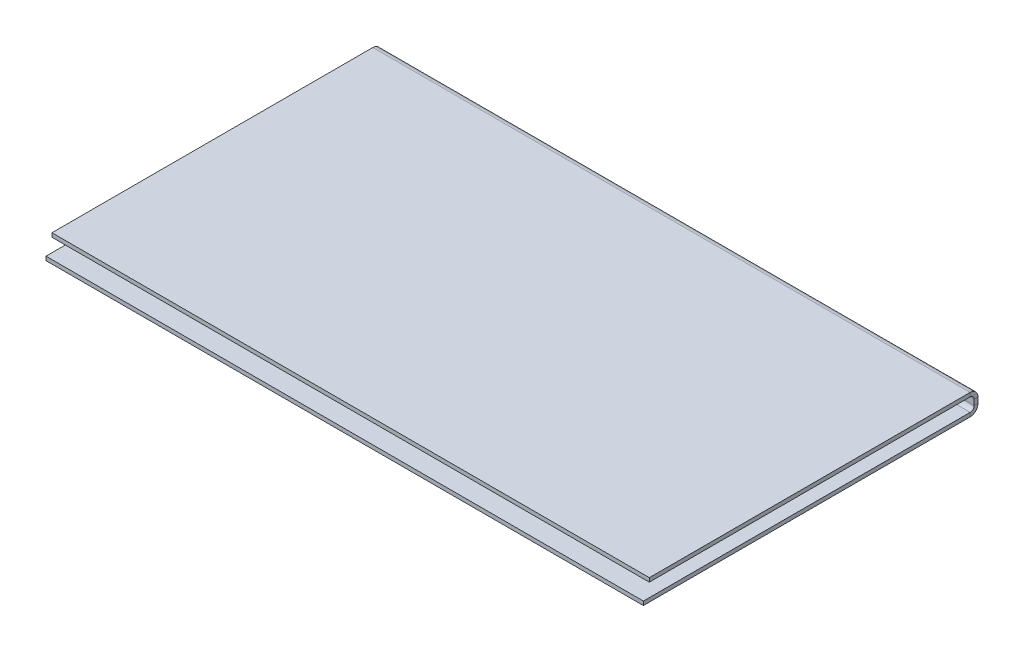
ISO-10303-21;
HEADER;
FILE_DESCRIPTION(('STEP AP214'),'2;1');
FILE_NAME('part.step','',(''),(''),'','','');
FILE_SCHEMA(('AUTOMOTIVE_DESIGN { 1 0 10303 214 1 1 1 1 }'));
ENDSEC;
DATA;
#1=APPLICATION_CONTEXT('core data for automotive mechanical design processes');
#2=APPLICATION_PROTOCOL_DEFINITION('international standard','automotive_design',2000,#1);
#3=PRODUCT_CONTEXT('',#1,'mechanical');
#4=PRODUCT('Part','Part','',(#3));
#5=PRODUCT_RELATED_PRODUCT_CATEGORY('part','',(#4));
#6=PRODUCT_DEFINITION_FORMATION('','',#4);
#7=PRODUCT_DEFINITION_CONTEXT('part definition',#1,'design');
#8=PRODUCT_DEFINITION('design','',#6,#7);
#9=PRODUCT_DEFINITION_SHAPE('','',#8);
#10=(LENGTH_UNIT() NAMED_UNIT(*) SI_UNIT(.MILLI.,.METRE.));
#11=(NAMED_UNIT(*) PLANE_ANGLE_UNIT() SI_UNIT($,.RADIAN.));
#12=(NAMED_UNIT(*) SI_UNIT($,.STERADIAN.) SOLID_ANGLE_UNIT());
#13=UNCERTAINTY_MEASURE_WITH_UNIT(LENGTH_MEASURE(1.E-05),#10,'distance_accuracy_value','');
#14=(GEOMETRIC_REPRESENTATION_CONTEXT(3) GLOBAL_UNCERTAINTY_ASSIGNED_CONTEXT((#13)) GLOBAL_UNIT_ASSIGNED_CONTEXT((#10,
#11,#12)) REPRESENTATION_CONTEXT('',''));
#15=CARTESIAN_POINT('',(0.,0.,0.));
#16=DIRECTION('',(0.,0.,1.));
#17=DIRECTION('',(1.,0.,0.));
#18=AXIS2_PLACEMENT_3D('',#15,#16,#17);
#19=CARTESIAN_POINT('',(0.,3.2634,-63.1208616509441));
#20=DIRECTION('',(-1.,0.,0.));
#21=DIRECTION('',(0.,0.,1.));
#22=AXIS2_PLACEMENT_3D('',#19,#20,#21);
#23=PLANE('',#22);
#24=DIRECTION('',(0.,-1.,0.));
#25=VECTOR('',#24,1.);
#26=CARTESIAN_POINT('',(0.,0.,-62.3842616509441));
#27=LINE('',#26,#25);
#28=CARTESIAN_POINT('',(0.,1.79020000000001,-62.3842616509441));
#29=VERTEX_POINT('',#28);
#30=CARTESIAN_POINT('',(0.,0.736599999999992,-62.3842616509441));
#31=VERTEX_POINT('',#30);
#32=EDGE_CURVE('E249',#29,#31,#27,.T.);
#33=ORIENTED_EDGE('',*,*,#32,.F.);
#34=DIRECTION('',(0.,0.,-1.));
#35=VECTOR('',#34,1.);
#36=CARTESIAN_POINT('',(0.,1.79020000000001,-62.3842616509441));
#37=LINE('',#36,#35);
#38=CARTESIAN_POINT('',(0.,1.79020000000001,-63.1208616509441));
#39=VERTEX_POINT('',#38);
#40=EDGE_CURVE('E231',#29,#39,#37,.T.);
#41=ORIENTED_EDGE('',*,*,#40,.T.);
#42=DIRECTION('',(0.,1.,0.));
#43=VECTOR('',#42,1.);
#44=CARTESIAN_POINT('',(0.,3.2634,-63.1208616509441));
#45=LINE('',#44,#43);
#46=CARTESIAN_POINT('',(0.,0.736600000000002,-63.1208616509441));
#47=VERTEX_POINT('',#46);
#48=EDGE_CURVE('E243',#39,#47,#45,.F.);
#49=ORIENTED_EDGE('',*,*,#48,.T.);
#50=DIRECTION('',(0.,0.,-1.));
#51=VECTOR('',#50,1.);
#52=CARTESIAN_POINT('',(0.,0.736599999999997,-62.3842616509441));
#53=LINE('',#52,#51);
#54=EDGE_CURVE('E255',#31,#47,#53,.T.);
#55=ORIENTED_EDGE('',*,*,#54,.F.);
#56=EDGE_LOOP('',(#33,#41,#49,#55));
#57=FACE_BOUND('',#56,.T.);
#58=ADVANCED_FACE('F85',(#57),#23,.T.);
#59=CARTESIAN_POINT('',(0.,0.,-63.1208616509441));
#60=DIRECTION('',(0.,0.,1.));
#61=DIRECTION('',(1.,0.,0.));
#62=AXIS2_PLACEMENT_3D('',#59,#60,#61);
#63=PLANE('',#62);
#64=DIRECTION('',(-1.,0.,0.));
#65=VECTOR('',#64,1.);
#66=CARTESIAN_POINT('',(0.,1.79020000000001,-63.1208616509441));
#67=LINE('',#66,#65);
#68=CARTESIAN_POINT('',(112.686822752281,1.79020000000001,-63.1208616509441));
#69=VERTEX_POINT('',#68);
#70=EDGE_CURVE('E181',#39,#69,#67,.F.);
#71=ORIENTED_EDGE('',*,*,#70,.T.);
#72=DIRECTION('',(0.,-1.,0.));
#73=VECTOR('',#72,1.);
#74=CARTESIAN_POINT('',(112.686822752281,0.,-63.1208616509441));
#75=LINE('',#74,#73);
#76=CARTESIAN_POINT('',(112.686822752281,0.736599999999992,-63.1208616509441));
#77=VERTEX_POINT('',#76);
#78=EDGE_CURVE('E246',#77,#69,#75,.F.);
#79=ORIENTED_EDGE('',*,*,#78,.F.);
#80=DIRECTION('',(-1.,0.,0.));
#81=VECTOR('',#80,1.);
#82=CARTESIAN_POINT('',(112.686822752281,0.736600000000002,-63.1208616509441));
#83=LINE('',#82,#81);
#84=EDGE_CURVE('E253',#47,#77,#83,.F.);
#85=ORIENTED_EDGE('',*,*,#84,.F.);
#86=ORIENTED_EDGE('',*,*,#48,.F.);
#87=EDGE_LOOP('',(#71,#79,#85,#86));
#88=FACE_BOUND('',#87,.T.);
#89=ADVANCED_FACE('F349',(#88),#63,.F.);
#90=CARTESIAN_POINT('',(0.,0.,-62.3842616509441));
#91=DIRECTION('',(0.,0.,1.));
#92=DIRECTION('',(1.,0.,0.));
#93=AXIS2_PLACEMENT_3D('',#90,#91,#92);
#94=PLANE('',#93);
#95=DIRECTION('',(0.,1.,0.));
#96=VECTOR('',#95,1.);
#97=CARTESIAN_POINT('',(112.686822752281,0.,-62.3842616509441));
#98=LINE('',#97,#96);
#99=CARTESIAN_POINT('',(112.686822752281,0.736599999999992,-62.3842616509441));
#100=VERTEX_POINT('',#99);
#101=CARTESIAN_POINT('',(112.686822752281,1.79020000000001,-62.3842616509441));
#102=VERTEX_POINT('',#101);
#103=EDGE_CURVE('E251',#100,#102,#98,.T.);
#104=ORIENTED_EDGE('',*,*,#103,.T.);
#105=DIRECTION('',(-1.,0.,0.));
#106=VECTOR('',#105,1.);
#107=CARTESIAN_POINT('',(0.,1.79020000000001,-62.3842616509441));
#108=LINE('',#107,#106);
#109=EDGE_CURVE('E100',#29,#102,#108,.F.);
#110=ORIENTED_EDGE('',*,*,#109,.F.);
#111=ORIENTED_EDGE('',*,*,#32,.T.);
#112=DIRECTION('',(-1.,0.,0.));
#113=VECTOR('',#112,1.);
#114=CARTESIAN_POINT('',(112.686822752281,0.736599999999997,-62.3842616509441));
#115=LINE('',#114,#113);
#116=EDGE_CURVE('E258',#100,#31,#115,.T.);
#117=ORIENTED_EDGE('',*,*,#116,.F.);
#118=EDGE_LOOP('',(#104,#110,#111,#117));
#119=FACE_BOUND('',#118,.T.);
#120=ADVANCED_FACE('F356',(#119),#94,.T.);
#121=CARTESIAN_POINT('',(0.,-0.7366,0.));
#122=DIRECTION('',(-1.,0.,0.));
#123=DIRECTION('',(0.,0.,1.));
#124=AXIS2_PLACEMENT_3D('',#121,#122,#123);
#125=PLANE('',#124);
#126=DIRECTION('',(0.,0.,1.));
#127=VECTOR('',#126,1.);
#128=CARTESIAN_POINT('',(0.,0.,0.));
#129=LINE('',#128,#127);
#130=CARTESIAN_POINT('',(0.,0.,-61.6476616509441));
#131=VERTEX_POINT('',#130);
#132=CARTESIAN_POINT('',(0.,0.,0.));
#133=VERTEX_POINT('',#132);
#134=EDGE_CURVE('E292',#131,#133,#129,.T.);
#135=ORIENTED_EDGE('',*,*,#134,.F.);
#136=DIRECTION('',(0.,-1.,0.));
#137=VECTOR('',#136,1.);
#138=CARTESIAN_POINT('',(0.,0.,-61.6476616509441));
#139=LINE('',#138,#137);
#140=CARTESIAN_POINT('',(0.,-0.736600000000005,-61.6476616509441));
#141=VERTEX_POINT('',#140);
#142=EDGE_CURVE('E268',#131,#141,#139,.T.);
#143=ORIENTED_EDGE('',*,*,#142,.T.);
#144=DIRECTION('',(0.,0.,1.));
#145=VECTOR('',#144,1.);
#146=CARTESIAN_POINT('',(0.,-0.7366,0.));
#147=LINE('',#146,#145);
#148=CARTESIAN_POINT('',(0.,-0.7366,0.));
#149=VERTEX_POINT('',#148);
#150=EDGE_CURVE('E295',#141,#149,#147,.T.);
#151=ORIENTED_EDGE('',*,*,#150,.T.);
#152=DIRECTION('',(0.,1.,0.));
#153=VECTOR('',#152,1.);
#154=CARTESIAN_POINT('',(0.,-0.7366,0.));
#155=LINE('',#154,#153);
#156=EDGE_CURVE('E89',#149,#133,#155,.T.);
#157=ORIENTED_EDGE('',*,*,#156,.T.);
#158=EDGE_LOOP('',(#135,#143,#151,#157));
#159=FACE_BOUND('',#158,.T.);
#160=ADVANCED_FACE('F87',(#159),#125,.T.);
#161=CARTESIAN_POINT('',(0.,-0.7366,0.));
#162=DIRECTION('',(0.,-1.,0.));
#163=DIRECTION('',(0.,0.,-1.));
#164=AXIS2_PLACEMENT_3D('',#161,#162,#163);
#165=PLANE('',#164);
#166=CARTESIAN_POINT('',(50.3806354978577,-0.7366,-13.1300326562346));
#167=DIRECTION('',(0.,1.,0.));
#168=DIRECTION('',(0.,0.,-1.));
#169=AXIS2_PLACEMENT_3D('',#166,#167,#168);
#170=CIRCLE('',#169,5.44342469547312);
#171=CARTESIAN_POINT('',(50.3806354978577,-0.7366,-18.5734573517077));
#172=VERTEX_POINT('',#171);
#173=EDGE_CURVE('E283',#172,#172,#170,.T.);
#174=ORIENTED_EDGE('',*,*,#173,.T.);
#175=EDGE_LOOP('',(#174));
#176=FACE_BOUND('',#175,.T.);
#177=CARTESIAN_POINT('',(50.3806354978577,-0.7366,-49.9908289947094));
#178=DIRECTION('',(0.,1.,0.));
#179=DIRECTION('',(0.,0.,1.));
#180=AXIS2_PLACEMENT_3D('',#177,#178,#179);
#181=CIRCLE('',#180,5.44342469547312);
#182=CARTESIAN_POINT('',(50.3806354978577,-0.7366,-44.5474042992363));
#183=VERTEX_POINT('',#182);
#184=EDGE_CURVE('E289',#183,#183,#181,.T.);
#185=ORIENTED_EDGE('',*,*,#184,.T.);
#186=EDGE_LOOP('',(#185));
#187=FACE_BOUND('',#186,.T.);
#188=ORIENTED_EDGE('',*,*,#150,.F.);
#189=DIRECTION('',(-1.,0.,0.));
#190=VECTOR('',#189,1.);
#191=CARTESIAN_POINT('',(0.,-0.736600000000005,-61.6476616509441));
#192=LINE('',#191,#190);
#193=CARTESIAN_POINT('',(112.686822752281,-0.7366,-61.6476616509441));
#194=VERTEX_POINT('',#193);
#195=EDGE_CURVE('E263',#141,#194,#192,.F.);
#196=ORIENTED_EDGE('',*,*,#195,.T.);
#197=DIRECTION('',(0.,0.,-1.));
#198=VECTOR('',#197,1.);
#199=CARTESIAN_POINT('',(112.686822752281,-0.7366,0.));
#200=LINE('',#199,#198);
#201=CARTESIAN_POINT('',(112.686822752281,-0.7366,0.));
#202=VERTEX_POINT('',#201);
#203=EDGE_CURVE('E301',#202,#194,#200,.T.);
#204=ORIENTED_EDGE('',*,*,#203,.F.);
#205=DIRECTION('',(1.,0.,0.));
#206=VECTOR('',#205,1.);
#207=CARTESIAN_POINT('',(0.,-0.7366,0.));
#208=LINE('',#207,#206);
#209=EDGE_CURVE('E297',#149,#202,#208,.T.);
#210=ORIENTED_EDGE('',*,*,#209,.F.);
#211=EDGE_LOOP('',(#188,#196,#204,#210));
#212=FACE_BOUND('',#211,.T.);
#213=ADVANCED_FACE('F324',(#176,#187,#212),#165,.T.);
#214=CARTESIAN_POINT('',(0.,0.,0.));
#215=DIRECTION('',(0.,-1.,0.));
#216=DIRECTION('',(0.,0.,-1.));
#217=AXIS2_PLACEMENT_3D('',#214,#215,#216);
#218=PLANE('',#217);
#219=CARTESIAN_POINT('',(50.3806354978577,0.,-49.9908289947094));
#220=DIRECTION('',(0.,1.,0.));
#221=DIRECTION('',(0.,0.,1.));
#222=AXIS2_PLACEMENT_3D('',#219,#220,#221);
#223=CIRCLE('',#222,5.44342469547312);
#224=CARTESIAN_POINT('',(50.3806354978577,0.,-44.5474042992363));
#225=VERTEX_POINT('',#224);
#226=EDGE_CURVE('E286',#225,#225,#223,.T.);
#227=ORIENTED_EDGE('',*,*,#226,.F.);
#228=EDGE_LOOP('',(#227));
#229=FACE_BOUND('',#228,.T.);
#230=CARTESIAN_POINT('',(50.3806354978577,0.,-13.1300326562346));
#231=DIRECTION('',(0.,1.,0.));
#232=DIRECTION('',(0.,0.,-1.));
#233=AXIS2_PLACEMENT_3D('',#230,#231,#232);
#234=CIRCLE('',#233,5.44342469547312);
#235=CARTESIAN_POINT('',(50.3806354978577,0.,-18.5734573517077));
#236=VERTEX_POINT('',#235);
#237=EDGE_CURVE('E280',#236,#236,#234,.T.);
#238=ORIENTED_EDGE('',*,*,#237,.F.);
#239=EDGE_LOOP('',(#238));
#240=FACE_BOUND('',#239,.T.);
#241=DIRECTION('',(-1.,0.,0.));
#242=VECTOR('',#241,1.);
#243=CARTESIAN_POINT('',(0.,0.,-61.6476616509441));
#244=LINE('',#243,#242);
#245=CARTESIAN_POINT('',(112.686822752281,0.,-61.6476616509441));
#246=VERTEX_POINT('',#245);
#247=EDGE_CURVE('E274',#131,#246,#244,.F.);
#248=ORIENTED_EDGE('',*,*,#247,.F.);
#249=ORIENTED_EDGE('',*,*,#134,.T.);
#250=DIRECTION('',(1.,0.,0.));
#251=VECTOR('',#250,1.);
#252=CARTESIAN_POINT('',(0.,0.,0.));
#253=LINE('',#252,#251);
#254=CARTESIAN_POINT('',(112.686822752281,0.,0.));
#255=VERTEX_POINT('',#254);
#256=EDGE_CURVE('E305',#133,#255,#253,.T.);
#257=ORIENTED_EDGE('',*,*,#256,.T.);
#258=DIRECTION('',(0.,0.,-1.));
#259=VECTOR('',#258,1.);
#260=CARTESIAN_POINT('',(112.686822752281,0.,0.));
#261=LINE('',#260,#259);
#262=EDGE_CURVE('E298',#255,#246,#261,.T.);
#263=ORIENTED_EDGE('',*,*,#262,.T.);
#264=EDGE_LOOP('',(#248,#249,#257,#263));
#265=FACE_BOUND('',#264,.T.);
#266=ADVANCED_FACE('F313',(#229,#240,#265),#218,.F.);
#267=CARTESIAN_POINT('',(112.686822752281,-0.7366,0.));
#268=DIRECTION('',(1.,0.,0.));
#269=DIRECTION('',(0.,0.,-1.));
#270=AXIS2_PLACEMENT_3D('',#267,#268,#269);
#271=PLANE('',#270);
#272=DIRECTION('',(0.,-1.,0.));
#273=VECTOR('',#272,1.);
#274=CARTESIAN_POINT('',(112.686822752281,0.,-61.6476616509441));
#275=LINE('',#274,#273);
#276=EDGE_CURVE('E278',#246,#194,#275,.T.);
#277=ORIENTED_EDGE('',*,*,#276,.F.);
#278=ORIENTED_EDGE('',*,*,#262,.F.);
#279=DIRECTION('',(0.,1.,0.));
#280=VECTOR('',#279,1.);
#281=CARTESIAN_POINT('',(112.686822752281,-0.7366,0.));
#282=LINE('',#281,#280);
#283=EDGE_CURVE('E13',#202,#255,#282,.T.);
#284=ORIENTED_EDGE('',*,*,#283,.F.);
#285=ORIENTED_EDGE('',*,*,#203,.T.);
#286=EDGE_LOOP('',(#277,#278,#284,#285));
#287=FACE_BOUND('',#286,.T.);
#288=ADVANCED_FACE('F317',(#287),#271,.T.);
#289=CARTESIAN_POINT('',(0.,-0.7366,0.));
#290=DIRECTION('',(0.,0.,1.));
#291=DIRECTION('',(1.,0.,0.));
#292=AXIS2_PLACEMENT_3D('',#289,#290,#291);
#293=PLANE('',#292);
#294=ORIENTED_EDGE('',*,*,#256,.F.);
#295=ORIENTED_EDGE('',*,*,#156,.F.);
#296=ORIENTED_EDGE('',*,*,#209,.T.);
#297=ORIENTED_EDGE('',*,*,#283,.T.);
#298=EDGE_LOOP('',(#294,#295,#296,#297));
#299=FACE_BOUND('',#298,.T.);
#300=ADVANCED_FACE('F337',(#299),#293,.T.);
#301=CARTESIAN_POINT('',(50.3806354978577,-0.7366,-49.9908289947094));
#302=DIRECTION('',(0.,1.,0.));
#303=DIRECTION('',(0.,0.,1.));
#304=AXIS2_PLACEMENT_3D('',#301,#302,#303);
#305=CYLINDRICAL_SURFACE('',#304,5.44342469547312);
#306=ORIENTED_EDGE('',*,*,#184,.F.);
#307=EDGE_LOOP('',(#306));
#308=FACE_BOUND('',#307,.T.);
#309=ORIENTED_EDGE('',*,*,#226,.T.);
#310=EDGE_LOOP('',(#309));
#311=FACE_BOUND('',#310,.T.);
#312=ADVANCED_FACE('F339',(#308,#311),#305,.F.);
#313=CARTESIAN_POINT('',(50.3806354978577,-0.7366,-13.1300326562346));
#314=DIRECTION('',(0.,1.,0.));
#315=DIRECTION('',(0.,0.,1.));
#316=AXIS2_PLACEMENT_3D('',#313,#314,#315);
#317=CYLINDRICAL_SURFACE('',#316,5.44342469547312);
#318=ORIENTED_EDGE('',*,*,#173,.F.);
#319=EDGE_LOOP('',(#318));
#320=FACE_BOUND('',#319,.T.);
#321=ORIENTED_EDGE('',*,*,#237,.T.);
#322=EDGE_LOOP('',(#321));
#323=FACE_BOUND('',#322,.T.);
#324=ADVANCED_FACE('F343',(#320,#323),#317,.F.);
#325=CARTESIAN_POINT('',(112.686822752281,0.736599999999992,-61.6476616509441));
#326=DIRECTION('',(1.,0.,0.));
#327=DIRECTION('',(0.,0.,-1.));
#328=AXIS2_PLACEMENT_3D('',#325,#326,#327);
#329=PLANE('',#328);
#330=DIRECTION('',(0.,0.,-1.));
#331=VECTOR('',#330,1.);
#332=CARTESIAN_POINT('',(112.686822752281,0.736600000000002,-63.1208616509441));
#333=LINE('',#332,#331);
#334=EDGE_CURVE('E240',#100,#77,#333,.T.);
#335=ORIENTED_EDGE('',*,*,#334,.F.);
#336=CARTESIAN_POINT('',(112.686822752281,0.736599999999992,-61.6476616509441));
#337=DIRECTION('',(-1.,0.,0.));
#338=DIRECTION('',(0.,0.,1.));
#339=AXIS2_PLACEMENT_3D('',#336,#337,#338);
#340=CIRCLE('',#339,0.736599999999997);
#341=EDGE_CURVE('E271',#246,#100,#340,.F.);
#342=ORIENTED_EDGE('',*,*,#341,.F.);
#343=ORIENTED_EDGE('',*,*,#276,.T.);
#344=CARTESIAN_POINT('',(112.686822752281,0.736599999999992,-61.6476616509441));
#345=DIRECTION('',(-1.,0.,0.));
#346=DIRECTION('',(0.,0.,1.));
#347=AXIS2_PLACEMENT_3D('',#344,#345,#346);
#348=CIRCLE('',#347,1.4732);
#349=EDGE_CURVE('E108',#194,#77,#348,.F.);
#350=ORIENTED_EDGE('',*,*,#349,.T.);
#351=EDGE_LOOP('',(#335,#342,#343,#350));
#352=FACE_BOUND('',#351,.T.);
#353=ADVANCED_FACE('F321',(#352),#329,.T.);
#354=CARTESIAN_POINT('',(0.,0.736599999999992,-61.6476616509441));
#355=DIRECTION('',(1.,0.,0.));
#356=DIRECTION('',(0.,0.,-1.));
#357=AXIS2_PLACEMENT_3D('',#354,#355,#356);
#358=PLANE('',#357);
#359=CARTESIAN_POINT('',(0.,0.736599999999992,-61.6476616509441));
#360=DIRECTION('',(-1.,0.,0.));
#361=DIRECTION('',(0.,0.,1.));
#362=AXIS2_PLACEMENT_3D('',#359,#360,#361);
#363=CIRCLE('',#362,0.736599999999997);
#364=EDGE_CURVE('E245',#31,#131,#363,.T.);
#365=ORIENTED_EDGE('',*,*,#364,.F.);
#366=ORIENTED_EDGE('',*,*,#54,.T.);
#367=CARTESIAN_POINT('',(0.,0.736599999999992,-61.6476616509441));
#368=DIRECTION('',(-1.,0.,0.));
#369=DIRECTION('',(0.,0.,1.));
#370=AXIS2_PLACEMENT_3D('',#367,#368,#369);
#371=CIRCLE('',#370,1.4732);
#372=EDGE_CURVE('E266',#47,#141,#371,.T.);
#373=ORIENTED_EDGE('',*,*,#372,.T.);
#374=ORIENTED_EDGE('',*,*,#142,.F.);
#375=EDGE_LOOP('',(#365,#366,#373,#374));
#376=FACE_BOUND('',#375,.T.);
#377=ADVANCED_FACE('F330',(#376),#358,.F.);
#378=CARTESIAN_POINT('',(0.,0.736599999999992,-61.6476616509441));
#379=DIRECTION('',(-1.,0.,0.));
#380=DIRECTION('',(0.,0.,-1.));
#381=AXIS2_PLACEMENT_3D('',#378,#379,#380);
#382=CYLINDRICAL_SURFACE('',#381,1.4732);
#383=ORIENTED_EDGE('',*,*,#195,.F.);
#384=ORIENTED_EDGE('',*,*,#372,.F.);
#385=ORIENTED_EDGE('',*,*,#84,.T.);
#386=ORIENTED_EDGE('',*,*,#349,.F.);
#387=EDGE_LOOP('',(#383,#384,#385,#386));
#388=FACE_BOUND('',#387,.T.);
#389=ADVANCED_FACE('F327',(#388),#382,.T.);
#390=CARTESIAN_POINT('',(0.,0.736599999999992,-61.6476616509441));
#391=DIRECTION('',(-1.,0.,0.));
#392=DIRECTION('',(0.,0.,-1.));
#393=AXIS2_PLACEMENT_3D('',#390,#391,#392);
#394=CYLINDRICAL_SURFACE('',#393,0.736599999999997);
#395=ORIENTED_EDGE('',*,*,#247,.T.);
#396=ORIENTED_EDGE('',*,*,#341,.T.);
#397=ORIENTED_EDGE('',*,*,#116,.T.);
#398=ORIENTED_EDGE('',*,*,#364,.T.);
#399=EDGE_LOOP('',(#395,#396,#397,#398));
#400=FACE_BOUND('',#399,.T.);
#401=ADVANCED_FACE('F365',(#400),#394,.F.);
#402=CARTESIAN_POINT('',(112.686822752281,0.,-63.1208616509441));
#403=DIRECTION('',(1.,0.,0.));
#404=DIRECTION('',(0.,0.,-1.));
#405=AXIS2_PLACEMENT_3D('',#402,#403,#404);
#406=PLANE('',#405);
#407=DIRECTION('',(0.,0.,-1.));
#408=VECTOR('',#407,1.);
#409=CARTESIAN_POINT('',(112.686822752281,1.79020000000001,-62.3842616509441));
#410=LINE('',#409,#408);
#411=EDGE_CURVE('E237',#102,#69,#410,.T.);
#412=ORIENTED_EDGE('',*,*,#411,.F.);
#413=ORIENTED_EDGE('',*,*,#103,.F.);
#414=ORIENTED_EDGE('',*,*,#334,.T.);
#415=ORIENTED_EDGE('',*,*,#78,.T.);
#416=EDGE_LOOP('',(#412,#413,#414,#415));
#417=FACE_BOUND('',#416,.T.);
#418=ADVANCED_FACE('F361',(#417),#406,.T.);
#419=CARTESIAN_POINT('',(112.686822752281,1.79020000000001,-61.6476616509441));
#420=DIRECTION('',(1.,0.,0.));
#421=DIRECTION('',(0.,0.,-1.));
#422=AXIS2_PLACEMENT_3D('',#419,#420,#421);
#423=PLANE('',#422);
#424=DIRECTION('',(0.,1.,0.));
#425=VECTOR('',#424,1.);
#426=CARTESIAN_POINT('',(112.686822752281,3.26340000000001,-61.6476616509441));
#427=LINE('',#426,#425);
#428=CARTESIAN_POINT('',(112.686822752281,2.52680000000001,-61.6476616509441));
#429=VERTEX_POINT('',#428);
#430=CARTESIAN_POINT('',(112.686822752281,3.26340000000001,-61.6476616509441));
#431=VERTEX_POINT('',#430);
#432=EDGE_CURVE('E226',#429,#431,#427,.T.);
#433=ORIENTED_EDGE('',*,*,#432,.F.);
#434=CARTESIAN_POINT('',(112.686822752281,1.79020000000001,-61.6476616509441));
#435=DIRECTION('',(-1.,0.,0.));
#436=DIRECTION('',(0.,0.,1.));
#437=AXIS2_PLACEMENT_3D('',#434,#435,#436);
#438=CIRCLE('',#437,0.7366);
#439=EDGE_CURVE('E184',#102,#429,#438,.F.);
#440=ORIENTED_EDGE('',*,*,#439,.F.);
#441=ORIENTED_EDGE('',*,*,#411,.T.);
#442=CARTESIAN_POINT('',(112.686822752281,1.79020000000001,-61.6476616509441));
#443=DIRECTION('',(-1.,0.,0.));
#444=DIRECTION('',(0.,0.,1.));
#445=AXIS2_PLACEMENT_3D('',#442,#443,#444);
#446=CIRCLE('',#445,1.4732);
#447=EDGE_CURVE('E230',#69,#431,#446,.F.);
#448=ORIENTED_EDGE('',*,*,#447,.T.);
#449=EDGE_LOOP('',(#433,#440,#441,#448));
#450=FACE_BOUND('',#449,.T.);
#451=ADVANCED_FACE('F364',(#450),#423,.T.);
#452=CARTESIAN_POINT('',(0.,1.79020000000001,-61.6476616509441));
#453=DIRECTION('',(1.,0.,0.));
#454=DIRECTION('',(0.,0.,-1.));
#455=AXIS2_PLACEMENT_3D('',#452,#453,#454);
#456=PLANE('',#455);
#457=CARTESIAN_POINT('',(0.,1.79020000000001,-61.6476616509441));
#458=DIRECTION('',(-1.,0.,0.));
#459=DIRECTION('',(0.,0.,1.));
#460=AXIS2_PLACEMENT_3D('',#457,#458,#459);
#461=CIRCLE('',#460,0.7366);
#462=CARTESIAN_POINT('',(0.,2.52680000000001,-61.6476616509441));
#463=VERTEX_POINT('',#462);
#464=EDGE_CURVE('E191',#463,#29,#461,.T.);
#465=ORIENTED_EDGE('',*,*,#464,.F.);
#466=DIRECTION('',(0.,1.,0.));
#467=VECTOR('',#466,1.);
#468=CARTESIAN_POINT('',(0.,2.52680000000001,-61.6476616509441));
#469=LINE('',#468,#467);
#470=CARTESIAN_POINT('',(0.,3.26340000000001,-61.6476616509441));
#471=VERTEX_POINT('',#470);
#472=EDGE_CURVE('E188',#463,#471,#469,.T.);
#473=ORIENTED_EDGE('',*,*,#472,.T.);
#474=CARTESIAN_POINT('',(0.,1.79020000000001,-61.6476616509441));
#475=DIRECTION('',(-1.,0.,0.));
#476=DIRECTION('',(0.,0.,1.));
#477=AXIS2_PLACEMENT_3D('',#474,#475,#476);
#478=CIRCLE('',#477,1.4732);
#479=EDGE_CURVE('E174',#471,#39,#478,.T.);
#480=ORIENTED_EDGE('',*,*,#479,.T.);
#481=ORIENTED_EDGE('',*,*,#40,.F.);
#482=EDGE_LOOP('',(#465,#473,#480,#481));
#483=FACE_BOUND('',#482,.T.);
#484=ADVANCED_FACE('F189',(#483),#456,.F.);
#485=CARTESIAN_POINT('',(0.,1.79020000000001,-61.6476616509441));
#486=DIRECTION('',(-1.,0.,0.));
#487=DIRECTION('',(0.,1.,0.));
#488=AXIS2_PLACEMENT_3D('',#485,#486,#487);
#489=CYLINDRICAL_SURFACE('',#488,1.4732);
#490=ORIENTED_EDGE('',*,*,#70,.F.);
#491=ORIENTED_EDGE('',*,*,#479,.F.);
#492=DIRECTION('',(-1.,0.,0.));
#493=VECTOR('',#492,1.);
#494=CARTESIAN_POINT('',(0.,3.26340000000001,-61.6476616509441));
#495=LINE('',#494,#493);
#496=EDGE_CURVE('E179',#431,#471,#495,.T.);
#497=ORIENTED_EDGE('',*,*,#496,.F.);
#498=ORIENTED_EDGE('',*,*,#447,.F.);
#499=EDGE_LOOP('',(#490,#491,#497,#498));
#500=FACE_BOUND('',#499,.T.);
#501=ADVANCED_FACE('F176',(#500),#489,.T.);
#502=CARTESIAN_POINT('',(0.,1.79020000000001,-61.6476616509441));
#503=DIRECTION('',(-1.,0.,0.));
#504=DIRECTION('',(0.,1.,0.));
#505=AXIS2_PLACEMENT_3D('',#502,#503,#504);
#506=CYLINDRICAL_SURFACE('',#505,0.7366);
#507=ORIENTED_EDGE('',*,*,#109,.T.);
#508=ORIENTED_EDGE('',*,*,#439,.T.);
#509=DIRECTION('',(1.,0.,0.));
#510=VECTOR('',#509,1.);
#511=CARTESIAN_POINT('',(112.686822752281,2.52680000000001,-61.6476616509441));
#512=LINE('',#511,#510);
#513=EDGE_CURVE('E196',#429,#463,#512,.F.);
#514=ORIENTED_EDGE('',*,*,#513,.T.);
#515=ORIENTED_EDGE('',*,*,#464,.T.);
#516=EDGE_LOOP('',(#507,#508,#514,#515));
#517=FACE_BOUND('',#516,.T.);
#518=ADVANCED_FACE('F474',(#517),#506,.F.);
#519=CARTESIAN_POINT('',(0.,3.2634,-62.3842616509441));
#520=DIRECTION('',(-1.,0.,0.));
#521=DIRECTION('',(0.,0.,1.));
#522=AXIS2_PLACEMENT_3D('',#519,#520,#521);
#523=PLANE('',#522);
#524=DIRECTION('',(0.,0.,-1.));
#525=VECTOR('',#524,1.);
#526=CARTESIAN_POINT('',(0.,3.2634,-62.3842616509441));
#527=LINE('',#526,#525);
#528=CARTESIAN_POINT('',(0.,3.26340000000022,-1.12086165094402));
#529=VERTEX_POINT('',#528);
#530=EDGE_CURVE('E203',#529,#471,#527,.T.);
#531=ORIENTED_EDGE('',*,*,#530,.T.);
#532=ORIENTED_EDGE('',*,*,#472,.F.);
#533=DIRECTION('',(0.,0.,1.));
#534=VECTOR('',#533,1.);
#535=CARTESIAN_POINT('',(0.,2.52680000000022,0.));
#536=LINE('',#535,#534);
#537=CARTESIAN_POINT('',(0.,2.52680000000022,-1.12086165094402));
#538=VERTEX_POINT('',#537);
#539=EDGE_CURVE('E219',#538,#463,#536,.F.);
#540=ORIENTED_EDGE('',*,*,#539,.F.);
#541=DIRECTION('',(0.,-1.,0.));
#542=VECTOR('',#541,1.);
#543=CARTESIAN_POINT('',(0.,3.26340000000022,-1.12086165094402));
#544=LINE('',#543,#542);
#545=EDGE_CURVE('E208',#529,#538,#544,.T.);
#546=ORIENTED_EDGE('',*,*,#545,.F.);
#547=EDGE_LOOP('',(#531,#532,#540,#546));
#548=FACE_BOUND('',#547,.T.);
#549=ADVANCED_FACE('F207',(#548),#523,.T.);
#550=CARTESIAN_POINT('',(112.686822752281,3.26340000000022,-1.12086165094402));
#551=DIRECTION('',(1.,0.,0.));
#552=DIRECTION('',(0.,0.,-1.));
#553=AXIS2_PLACEMENT_3D('',#550,#551,#552);
#554=PLANE('',#553);
#555=DIRECTION('',(0.,0.,-1.));
#556=VECTOR('',#555,1.);
#557=CARTESIAN_POINT('',(112.686822752281,2.52680000000022,0.));
#558=LINE('',#557,#556);
#559=CARTESIAN_POINT('',(112.686822752281,2.52680000000022,-1.12086165094402));
#560=VERTEX_POINT('',#559);
#561=EDGE_CURVE('E205',#429,#560,#558,.F.);
#562=ORIENTED_EDGE('',*,*,#561,.F.);
#563=ORIENTED_EDGE('',*,*,#432,.T.);
#564=DIRECTION('',(0.,0.,1.));
#565=VECTOR('',#564,1.);
#566=CARTESIAN_POINT('',(112.686822752281,3.26340000000022,-1.12086165094402));
#567=LINE('',#566,#565);
#568=CARTESIAN_POINT('',(112.686822752281,3.26340000000022,-1.12086165094402));
#569=VERTEX_POINT('',#568);
#570=EDGE_CURVE('E204',#431,#569,#567,.T.);
#571=ORIENTED_EDGE('',*,*,#570,.T.);
#572=DIRECTION('',(0.,-1.,0.));
#573=VECTOR('',#572,1.);
#574=CARTESIAN_POINT('',(112.686822752281,3.26340000000022,-1.12086165094402));
#575=LINE('',#574,#573);
#576=EDGE_CURVE('E210',#569,#560,#575,.T.);
#577=ORIENTED_EDGE('',*,*,#576,.T.);
#578=EDGE_LOOP('',(#562,#563,#571,#577));
#579=FACE_BOUND('',#578,.T.);
#580=ADVANCED_FACE('F494',(#579),#554,.T.);
#581=CARTESIAN_POINT('',(0.,3.26340000000022,0.));
#582=DIRECTION('',(0.,1.,0.));
#583=DIRECTION('',(0.,0.,1.));
#584=AXIS2_PLACEMENT_3D('',#581,#582,#583);
#585=PLANE('',#584);
#586=ORIENTED_EDGE('',*,*,#570,.F.);
#587=ORIENTED_EDGE('',*,*,#496,.T.);
#588=ORIENTED_EDGE('',*,*,#530,.F.);
#589=DIRECTION('',(-1.,0.,0.));
#590=VECTOR('',#589,1.);
#591=CARTESIAN_POINT('',(0.,3.26340000000022,-1.12086165094402));
#592=LINE('',#591,#590);
#593=EDGE_CURVE('E211',#569,#529,#592,.T.);
#594=ORIENTED_EDGE('',*,*,#593,.F.);
#595=EDGE_LOOP('',(#586,#587,#588,#594));
#596=FACE_BOUND('',#595,.T.);
#597=ADVANCED_FACE('F201',(#596),#585,.T.);
#598=CARTESIAN_POINT('',(0.,2.52680000000022,0.));
#599=DIRECTION('',(0.,1.,0.));
#600=DIRECTION('',(0.,0.,1.));
#601=AXIS2_PLACEMENT_3D('',#598,#599,#600);
#602=PLANE('',#601);
#603=ORIENTED_EDGE('',*,*,#513,.F.);
#604=ORIENTED_EDGE('',*,*,#561,.T.);
#605=DIRECTION('',(1.,0.,0.));
#606=VECTOR('',#605,1.);
#607=CARTESIAN_POINT('',(0.,2.52680000000022,-1.12086165094402));
#608=LINE('',#607,#606);
#609=EDGE_CURVE('E221',#560,#538,#608,.F.);
#610=ORIENTED_EDGE('',*,*,#609,.T.);
#611=ORIENTED_EDGE('',*,*,#539,.T.);
#612=EDGE_LOOP('',(#603,#604,#610,#611));
#613=FACE_BOUND('',#612,.T.);
#614=ADVANCED_FACE('F514',(#613),#602,.F.);
#615=CARTESIAN_POINT('',(0.,3.26340000000022,-1.12086165094402));
#616=DIRECTION('',(0.,0.,1.));
#617=DIRECTION('',(0.,-1.,0.));
#618=AXIS2_PLACEMENT_3D('',#615,#616,#617);
#619=PLANE('',#618);
#620=ORIENTED_EDGE('',*,*,#609,.F.);
#621=ORIENTED_EDGE('',*,*,#576,.F.);
#622=ORIENTED_EDGE('',*,*,#593,.T.);
#623=ORIENTED_EDGE('',*,*,#545,.T.);
#624=EDGE_LOOP('',(#620,#621,#622,#623));
#625=FACE_BOUND('',#624,.T.);
#626=ADVANCED_FACE('F524',(#625),#619,.T.);
#627=CLOSED_SHELL('',(#58,#89,#120,#160,#213,#266,#288,#300,#312,#324,#353,#377,#389,#401,#418,
#451,#484,#501,#518,#549,#580,#597,#614,#626));
#628=MANIFOLD_SOLID_BREP('B2',#627);
#629=ADVANCED_BREP_SHAPE_REPRESENTATION('',(#18,#628),#14);
#630=SHAPE_DEFINITION_REPRESENTATION(#9,#629);
ENDSEC;
END-ISO-10303-21;
